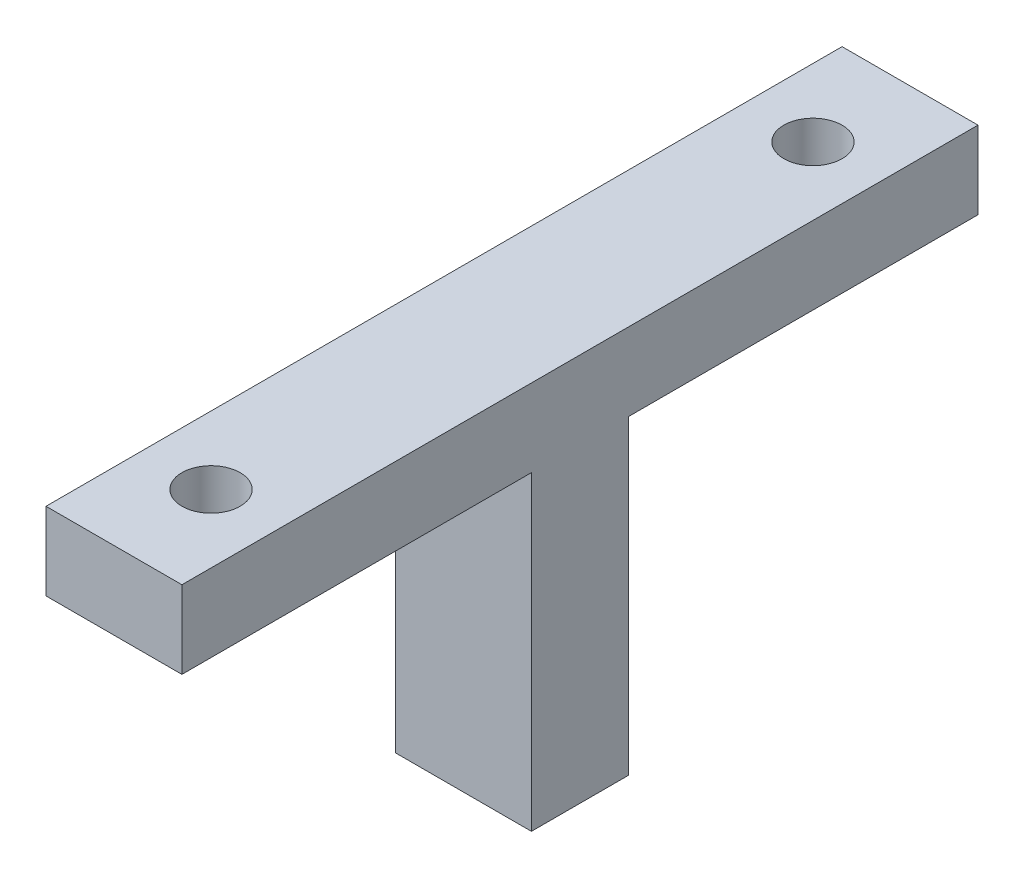
ISO-10303-21;
HEADER;
FILE_DESCRIPTION(('STEP AP214'),'2;1');
FILE_NAME('part.step','',(''),(''),'','','');
FILE_SCHEMA(('AUTOMOTIVE_DESIGN { 1 0 10303 214 1 1 1 1 }'));
ENDSEC;
DATA;
#1=APPLICATION_CONTEXT('core data for automotive mechanical design processes');
#2=APPLICATION_PROTOCOL_DEFINITION('international standard','automotive_design',2000,#1);
#3=PRODUCT_CONTEXT('',#1,'mechanical');
#4=PRODUCT('Part','Part','',(#3));
#5=PRODUCT_RELATED_PRODUCT_CATEGORY('part','',(#4));
#6=PRODUCT_DEFINITION_FORMATION('','',#4);
#7=PRODUCT_DEFINITION_CONTEXT('part definition',#1,'design');
#8=PRODUCT_DEFINITION('design','',#6,#7);
#9=PRODUCT_DEFINITION_SHAPE('','',#8);
#10=(LENGTH_UNIT() NAMED_UNIT(*) SI_UNIT(.MILLI.,.METRE.));
#11=(NAMED_UNIT(*) PLANE_ANGLE_UNIT() SI_UNIT($,.RADIAN.));
#12=(NAMED_UNIT(*) SI_UNIT($,.STERADIAN.) SOLID_ANGLE_UNIT());
#13=UNCERTAINTY_MEASURE_WITH_UNIT(LENGTH_MEASURE(1.E-05),#10,'distance_accuracy_value','');
#14=(GEOMETRIC_REPRESENTATION_CONTEXT(3) GLOBAL_UNCERTAINTY_ASSIGNED_CONTEXT((#13)) GLOBAL_UNIT_ASSIGNED_CONTEXT((#10,
#11,#12)) REPRESENTATION_CONTEXT('',''));
#15=CARTESIAN_POINT('',(0.,0.,0.));
#16=DIRECTION('',(0.,0.,1.));
#17=DIRECTION('',(1.,0.,0.));
#18=AXIS2_PLACEMENT_3D('',#15,#16,#17);
#19=CARTESIAN_POINT('',(-3.5,20.,2.5));
#20=DIRECTION('',(0.,0.,-1.));
#21=DIRECTION('',(-1.,0.,0.));
#22=AXIS2_PLACEMENT_3D('',#19,#20,#21);
#23=PLANE('',#22);
#24=DIRECTION('',(1.,0.,0.));
#25=VECTOR('',#24,1.);
#26=CARTESIAN_POINT('',(-3.5,16.,2.5));
#27=LINE('',#26,#25);
#28=CARTESIAN_POINT('',(-3.5,16.,2.5));
#29=VERTEX_POINT('',#28);
#30=CARTESIAN_POINT('',(3.5,16.,2.5));
#31=VERTEX_POINT('',#30);
#32=EDGE_CURVE('E70',#29,#31,#27,.T.);
#33=ORIENTED_EDGE('',*,*,#32,.F.);
#34=DIRECTION('',(0.,-1.,0.));
#35=VECTOR('',#34,1.);
#36=CARTESIAN_POINT('',(-3.5,20.,2.5));
#37=LINE('',#36,#35);
#38=CARTESIAN_POINT('',(-3.5,0.,2.5));
#39=VERTEX_POINT('',#38);
#40=EDGE_CURVE('E205',#29,#39,#37,.T.);
#41=ORIENTED_EDGE('',*,*,#40,.T.);
#42=DIRECTION('',(1.,0.,0.));
#43=VECTOR('',#42,1.);
#44=CARTESIAN_POINT('',(-3.5,0.,2.5));
#45=LINE('',#44,#43);
#46=CARTESIAN_POINT('',(3.5,0.,2.5));
#47=VERTEX_POINT('',#46);
#48=EDGE_CURVE('E188',#39,#47,#45,.T.);
#49=ORIENTED_EDGE('',*,*,#48,.T.);
#50=DIRECTION('',(0.,-1.,0.));
#51=VECTOR('',#50,1.);
#52=CARTESIAN_POINT('',(3.5,20.,2.5));
#53=LINE('',#52,#51);
#54=EDGE_CURVE('E126',#31,#47,#53,.T.);
#55=ORIENTED_EDGE('',*,*,#54,.F.);
#56=EDGE_LOOP('',(#33,#41,#49,#55));
#57=FACE_BOUND('',#56,.T.);
#58=ADVANCED_FACE('F45',(#57),#23,.F.);
#59=CARTESIAN_POINT('',(3.5,20.,-2.5));
#60=DIRECTION('',(-1.,0.,0.));
#61=DIRECTION('',(0.,0.,1.));
#62=AXIS2_PLACEMENT_3D('',#59,#60,#61);
#63=PLANE('',#62);
#64=DIRECTION('',(0.,0.,-1.));
#65=VECTOR('',#64,1.);
#66=CARTESIAN_POINT('',(3.5,0.,-2.5));
#67=LINE('',#66,#65);
#68=CARTESIAN_POINT('',(3.5,0.,-2.5));
#69=VERTEX_POINT('',#68);
#70=EDGE_CURVE('E186',#47,#69,#67,.T.);
#71=ORIENTED_EDGE('',*,*,#70,.T.);
#72=DIRECTION('',(0.,-1.,0.));
#73=VECTOR('',#72,1.);
#74=CARTESIAN_POINT('',(3.5,20.,-2.5));
#75=LINE('',#74,#73);
#76=CARTESIAN_POINT('',(3.5,16.,-2.5));
#77=VERTEX_POINT('',#76);
#78=EDGE_CURVE('E11',#77,#69,#75,.T.);
#79=ORIENTED_EDGE('',*,*,#78,.F.);
#80=DIRECTION('',(0.,0.,1.));
#81=VECTOR('',#80,1.);
#82=CARTESIAN_POINT('',(3.5,16.,-20.5));
#83=LINE('',#82,#81);
#84=CARTESIAN_POINT('',(3.5,16.,-20.5));
#85=VERTEX_POINT('',#84);
#86=EDGE_CURVE('E62',#85,#77,#83,.T.);
#87=ORIENTED_EDGE('',*,*,#86,.F.);
#88=DIRECTION('',(0.,1.,0.));
#89=VECTOR('',#88,1.);
#90=CARTESIAN_POINT('',(3.5,20.,-20.5));
#91=LINE('',#90,#89);
#92=CARTESIAN_POINT('',(3.5,20.,-20.5));
#93=VERTEX_POINT('',#92);
#94=EDGE_CURVE('E141',#85,#93,#91,.T.);
#95=ORIENTED_EDGE('',*,*,#94,.T.);
#96=DIRECTION('',(0.,0.,-1.));
#97=VECTOR('',#96,1.);
#98=CARTESIAN_POINT('',(3.5,20.,-2.5));
#99=LINE('',#98,#97);
#100=CARTESIAN_POINT('',(3.5,20.,20.5));
#101=VERTEX_POINT('',#100);
#102=EDGE_CURVE('E127',#101,#93,#99,.T.);
#103=ORIENTED_EDGE('',*,*,#102,.F.);
#104=DIRECTION('',(0.,1.,0.));
#105=VECTOR('',#104,1.);
#106=CARTESIAN_POINT('',(3.5,20.,20.5));
#107=LINE('',#106,#105);
#108=CARTESIAN_POINT('',(3.5,16.,20.5));
#109=VERTEX_POINT('',#108);
#110=EDGE_CURVE('E169',#109,#101,#107,.T.);
#111=ORIENTED_EDGE('',*,*,#110,.F.);
#112=DIRECTION('',(0.,0.,-1.));
#113=VECTOR('',#112,1.);
#114=CARTESIAN_POINT('',(3.5,16.,20.5));
#115=LINE('',#114,#113);
#116=EDGE_CURVE('E176',#109,#31,#115,.T.);
#117=ORIENTED_EDGE('',*,*,#116,.T.);
#118=ORIENTED_EDGE('',*,*,#54,.T.);
#119=EDGE_LOOP('',(#71,#79,#87,#95,#103,#111,#117,#118));
#120=FACE_BOUND('',#119,.T.);
#121=ADVANCED_FACE('F47',(#120),#63,.F.);
#122=CARTESIAN_POINT('',(-3.5,20.,-2.5));
#123=DIRECTION('',(0.,0.,1.));
#124=DIRECTION('',(1.,0.,0.));
#125=AXIS2_PLACEMENT_3D('',#122,#123,#124);
#126=PLANE('',#125);
#127=DIRECTION('',(0.,-1.,0.));
#128=VECTOR('',#127,1.);
#129=CARTESIAN_POINT('',(-3.5,20.,-2.5));
#130=LINE('',#129,#128);
#131=CARTESIAN_POINT('',(-3.5,16.,-2.5));
#132=VERTEX_POINT('',#131);
#133=CARTESIAN_POINT('',(-3.5,0.,-2.5));
#134=VERTEX_POINT('',#133);
#135=EDGE_CURVE('E55',#132,#134,#130,.T.);
#136=ORIENTED_EDGE('',*,*,#135,.F.);
#137=DIRECTION('',(1.,0.,0.));
#138=VECTOR('',#137,1.);
#139=CARTESIAN_POINT('',(-3.5,16.,-2.5));
#140=LINE('',#139,#138);
#141=EDGE_CURVE('E137',#132,#77,#140,.T.);
#142=ORIENTED_EDGE('',*,*,#141,.T.);
#143=ORIENTED_EDGE('',*,*,#78,.T.);
#144=DIRECTION('',(-1.,0.,0.));
#145=VECTOR('',#144,1.);
#146=CARTESIAN_POINT('',(-3.5,0.,-2.5));
#147=LINE('',#146,#145);
#148=EDGE_CURVE('E193',#69,#134,#147,.T.);
#149=ORIENTED_EDGE('',*,*,#148,.T.);
#150=EDGE_LOOP('',(#136,#142,#143,#149));
#151=FACE_BOUND('',#150,.T.);
#152=ADVANCED_FACE('F214',(#151),#126,.F.);
#153=CARTESIAN_POINT('',(-3.5,20.,-2.5));
#154=DIRECTION('',(1.,0.,0.));
#155=DIRECTION('',(0.,0.,-1.));
#156=AXIS2_PLACEMENT_3D('',#153,#154,#155);
#157=PLANE('',#156);
#158=DIRECTION('',(0.,0.,1.));
#159=VECTOR('',#158,1.);
#160=CARTESIAN_POINT('',(-3.5,0.,-2.5));
#161=LINE('',#160,#159);
#162=EDGE_CURVE('E197',#134,#39,#161,.T.);
#163=ORIENTED_EDGE('',*,*,#162,.T.);
#164=ORIENTED_EDGE('',*,*,#40,.F.);
#165=DIRECTION('',(0.,0.,-1.));
#166=VECTOR('',#165,1.);
#167=CARTESIAN_POINT('',(-3.5,16.,20.5));
#168=LINE('',#167,#166);
#169=CARTESIAN_POINT('',(-3.5,16.,20.5));
#170=VERTEX_POINT('',#169);
#171=EDGE_CURVE('E182',#170,#29,#168,.T.);
#172=ORIENTED_EDGE('',*,*,#171,.F.);
#173=DIRECTION('',(0.,-1.,0.));
#174=VECTOR('',#173,1.);
#175=CARTESIAN_POINT('',(-3.5,20.,20.5));
#176=LINE('',#175,#174);
#177=CARTESIAN_POINT('',(-3.5,20.,20.5));
#178=VERTEX_POINT('',#177);
#179=EDGE_CURVE('E120',#178,#170,#176,.T.);
#180=ORIENTED_EDGE('',*,*,#179,.F.);
#181=DIRECTION('',(0.,0.,1.));
#182=VECTOR('',#181,1.);
#183=CARTESIAN_POINT('',(-3.5,20.,-2.5));
#184=LINE('',#183,#182);
#185=CARTESIAN_POINT('',(-3.5,20.,-20.5));
#186=VERTEX_POINT('',#185);
#187=EDGE_CURVE('E112',#186,#178,#184,.T.);
#188=ORIENTED_EDGE('',*,*,#187,.F.);
#189=DIRECTION('',(0.,-1.,0.));
#190=VECTOR('',#189,1.);
#191=CARTESIAN_POINT('',(-3.5,20.,-20.5));
#192=LINE('',#191,#190);
#193=CARTESIAN_POINT('',(-3.5,16.,-20.5));
#194=VERTEX_POINT('',#193);
#195=EDGE_CURVE('E116',#186,#194,#192,.T.);
#196=ORIENTED_EDGE('',*,*,#195,.T.);
#197=DIRECTION('',(0.,0.,1.));
#198=VECTOR('',#197,1.);
#199=CARTESIAN_POINT('',(-3.5,16.,-20.5));
#200=LINE('',#199,#198);
#201=EDGE_CURVE('E149',#194,#132,#200,.T.);
#202=ORIENTED_EDGE('',*,*,#201,.T.);
#203=ORIENTED_EDGE('',*,*,#135,.T.);
#204=EDGE_LOOP('',(#163,#164,#172,#180,#188,#196,#202,#203));
#205=FACE_BOUND('',#204,.T.);
#206=ADVANCED_FACE('F115',(#205),#157,.F.);
#207=CARTESIAN_POINT('',(0.,20.,0.));
#208=DIRECTION('',(0.,1.,0.));
#209=DIRECTION('',(0.,0.,1.));
#210=AXIS2_PLACEMENT_3D('',#207,#208,#209);
#211=PLANE('',#210);
#212=CARTESIAN_POINT('',(0.,20.,-15.5));
#213=DIRECTION('',(0.,1.,0.));
#214=DIRECTION('',(0.,0.,1.));
#215=AXIS2_PLACEMENT_3D('',#212,#213,#214);
#216=CIRCLE('',#215,1.49999999999998);
#217=CARTESIAN_POINT('',(0.,20.,-14.));
#218=VERTEX_POINT('',#217);
#219=EDGE_CURVE('E301',#218,#218,#216,.T.);
#220=ORIENTED_EDGE('',*,*,#219,.F.);
#221=EDGE_LOOP('',(#220));
#222=FACE_BOUND('',#221,.T.);
#223=CARTESIAN_POINT('',(0.,20.,15.5));
#224=DIRECTION('',(0.,1.,0.));
#225=DIRECTION('',(0.,0.,1.));
#226=AXIS2_PLACEMENT_3D('',#223,#224,#225);
#227=CIRCLE('',#226,1.49999999999998);
#228=CARTESIAN_POINT('',(0.,20.,17.));
#229=VERTEX_POINT('',#228);
#230=EDGE_CURVE('E156',#229,#229,#227,.T.);
#231=ORIENTED_EDGE('',*,*,#230,.F.);
#232=EDGE_LOOP('',(#231));
#233=FACE_BOUND('',#232,.T.);
#234=ORIENTED_EDGE('',*,*,#102,.T.);
#235=DIRECTION('',(-1.,0.,0.));
#236=VECTOR('',#235,1.);
#237=CARTESIAN_POINT('',(-3.5,20.,-20.5));
#238=LINE('',#237,#236);
#239=EDGE_CURVE('E133',#93,#186,#238,.T.);
#240=ORIENTED_EDGE('',*,*,#239,.T.);
#241=ORIENTED_EDGE('',*,*,#187,.T.);
#242=DIRECTION('',(-1.,0.,0.));
#243=VECTOR('',#242,1.);
#244=CARTESIAN_POINT('',(-3.5,20.,20.5));
#245=LINE('',#244,#243);
#246=EDGE_CURVE('E173',#101,#178,#245,.T.);
#247=ORIENTED_EDGE('',*,*,#246,.F.);
#248=EDGE_LOOP('',(#234,#240,#241,#247));
#249=FACE_BOUND('',#248,.T.);
#250=ADVANCED_FACE('F139',(#222,#233,#249),#211,.T.);
#251=CARTESIAN_POINT('',(0.,0.,0.));
#252=DIRECTION('',(0.,1.,0.));
#253=DIRECTION('',(0.,0.,1.));
#254=AXIS2_PLACEMENT_3D('',#251,#252,#253);
#255=PLANE('',#254);
#256=ORIENTED_EDGE('',*,*,#70,.F.);
#257=ORIENTED_EDGE('',*,*,#48,.F.);
#258=ORIENTED_EDGE('',*,*,#162,.F.);
#259=ORIENTED_EDGE('',*,*,#148,.F.);
#260=EDGE_LOOP('',(#256,#257,#258,#259));
#261=FACE_BOUND('',#260,.T.);
#262=ADVANCED_FACE('F218',(#261),#255,.F.);
#263=CARTESIAN_POINT('',(-3.5,16.,20.5));
#264=DIRECTION('',(0.,1.,0.));
#265=DIRECTION('',(0.,0.,1.));
#266=AXIS2_PLACEMENT_3D('',#263,#264,#265);
#267=PLANE('',#266);
#268=CARTESIAN_POINT('',(0.,16.,15.5));
#269=DIRECTION('',(0.,1.,0.));
#270=DIRECTION('',(0.,0.,1.));
#271=AXIS2_PLACEMENT_3D('',#268,#269,#270);
#272=CIRCLE('',#271,1.49999999999998);
#273=CARTESIAN_POINT('',(0.,16.,17.));
#274=VERTEX_POINT('',#273);
#275=EDGE_CURVE('E160',#274,#274,#272,.T.);
#276=ORIENTED_EDGE('',*,*,#275,.T.);
#277=EDGE_LOOP('',(#276));
#278=FACE_BOUND('',#277,.T.);
#279=ORIENTED_EDGE('',*,*,#32,.T.);
#280=ORIENTED_EDGE('',*,*,#116,.F.);
#281=DIRECTION('',(1.,0.,0.));
#282=VECTOR('',#281,1.);
#283=CARTESIAN_POINT('',(-3.5,16.,20.5));
#284=LINE('',#283,#282);
#285=EDGE_CURVE('E166',#170,#109,#284,.T.);
#286=ORIENTED_EDGE('',*,*,#285,.F.);
#287=ORIENTED_EDGE('',*,*,#171,.T.);
#288=EDGE_LOOP('',(#279,#280,#286,#287));
#289=FACE_BOUND('',#288,.T.);
#290=ADVANCED_FACE('F220',(#278,#289),#267,.F.);
#291=CARTESIAN_POINT('',(0.,0.,20.5));
#292=DIRECTION('',(0.,0.,1.));
#293=DIRECTION('',(1.,0.,0.));
#294=AXIS2_PLACEMENT_3D('',#291,#292,#293);
#295=PLANE('',#294);
#296=ORIENTED_EDGE('',*,*,#179,.T.);
#297=ORIENTED_EDGE('',*,*,#285,.T.);
#298=ORIENTED_EDGE('',*,*,#110,.T.);
#299=ORIENTED_EDGE('',*,*,#246,.T.);
#300=EDGE_LOOP('',(#296,#297,#298,#299));
#301=FACE_BOUND('',#300,.T.);
#302=ADVANCED_FACE('F224',(#301),#295,.T.);
#303=CARTESIAN_POINT('',(0.,20.,15.5));
#304=DIRECTION('',(0.,1.,0.));
#305=DIRECTION('',(0.,0.,1.));
#306=AXIS2_PLACEMENT_3D('',#303,#304,#305);
#307=CYLINDRICAL_SURFACE('',#306,1.49999999999998);
#308=ORIENTED_EDGE('',*,*,#230,.T.);
#309=EDGE_LOOP('',(#308));
#310=FACE_BOUND('',#309,.T.);
#311=ORIENTED_EDGE('',*,*,#275,.F.);
#312=EDGE_LOOP('',(#311));
#313=FACE_BOUND('',#312,.T.);
#314=ADVANCED_FACE('F228',(#310,#313),#307,.F.);
#315=CARTESIAN_POINT('',(-3.5,16.,-20.5));
#316=DIRECTION('',(0.,-1.,0.));
#317=DIRECTION('',(0.,0.,-1.));
#318=AXIS2_PLACEMENT_3D('',#315,#316,#317);
#319=PLANE('',#318);
#320=CARTESIAN_POINT('',(0.,16.,-15.5));
#321=DIRECTION('',(0.,-1.,0.));
#322=DIRECTION('',(0.,0.,-1.));
#323=AXIS2_PLACEMENT_3D('',#320,#321,#322);
#324=CIRCLE('',#323,1.49999999999998);
#325=CARTESIAN_POINT('',(0.,16.,-17.));
#326=VERTEX_POINT('',#325);
#327=EDGE_CURVE('E49',#326,#326,#324,.T.);
#328=ORIENTED_EDGE('',*,*,#327,.F.);
#329=EDGE_LOOP('',(#328));
#330=FACE_BOUND('',#329,.T.);
#331=ORIENTED_EDGE('',*,*,#141,.F.);
#332=ORIENTED_EDGE('',*,*,#201,.F.);
#333=DIRECTION('',(1.,0.,0.));
#334=VECTOR('',#333,1.);
#335=CARTESIAN_POINT('',(-3.5,16.,-20.5));
#336=LINE('',#335,#334);
#337=EDGE_CURVE('E135',#194,#85,#336,.T.);
#338=ORIENTED_EDGE('',*,*,#337,.T.);
#339=ORIENTED_EDGE('',*,*,#86,.T.);
#340=EDGE_LOOP('',(#331,#332,#338,#339));
#341=FACE_BOUND('',#340,.T.);
#342=ADVANCED_FACE('F226',(#330,#341),#319,.T.);
#343=CARTESIAN_POINT('',(0.,0.,-20.5));
#344=DIRECTION('',(0.,0.,-1.));
#345=DIRECTION('',(1.,0.,0.));
#346=AXIS2_PLACEMENT_3D('',#343,#344,#345);
#347=PLANE('',#346);
#348=ORIENTED_EDGE('',*,*,#195,.F.);
#349=ORIENTED_EDGE('',*,*,#239,.F.);
#350=ORIENTED_EDGE('',*,*,#94,.F.);
#351=ORIENTED_EDGE('',*,*,#337,.F.);
#352=EDGE_LOOP('',(#348,#349,#350,#351));
#353=FACE_BOUND('',#352,.T.);
#354=ADVANCED_FACE('F131',(#353),#347,.T.);
#355=CARTESIAN_POINT('',(0.,20.,-15.5));
#356=DIRECTION('',(0.,1.,0.));
#357=DIRECTION('',(0.,0.,1.));
#358=AXIS2_PLACEMENT_3D('',#355,#356,#357);
#359=CYLINDRICAL_SURFACE('',#358,1.49999999999998);
#360=ORIENTED_EDGE('',*,*,#327,.T.);
#361=EDGE_LOOP('',(#360));
#362=FACE_BOUND('',#361,.T.);
#363=ORIENTED_EDGE('',*,*,#219,.T.);
#364=EDGE_LOOP('',(#363));
#365=FACE_BOUND('',#364,.T.);
#366=ADVANCED_FACE('F235',(#362,#365),#359,.F.);
#367=CLOSED_SHELL('',(#58,#121,#152,#206,#250,#262,#290,#302,#314,#342,#354,#366));
#368=MANIFOLD_SOLID_BREP('B2',#367);
#369=ADVANCED_BREP_SHAPE_REPRESENTATION('',(#18,#368),#14);
#370=SHAPE_DEFINITION_REPRESENTATION(#9,#369);
ENDSEC;
END-ISO-10303-21;
